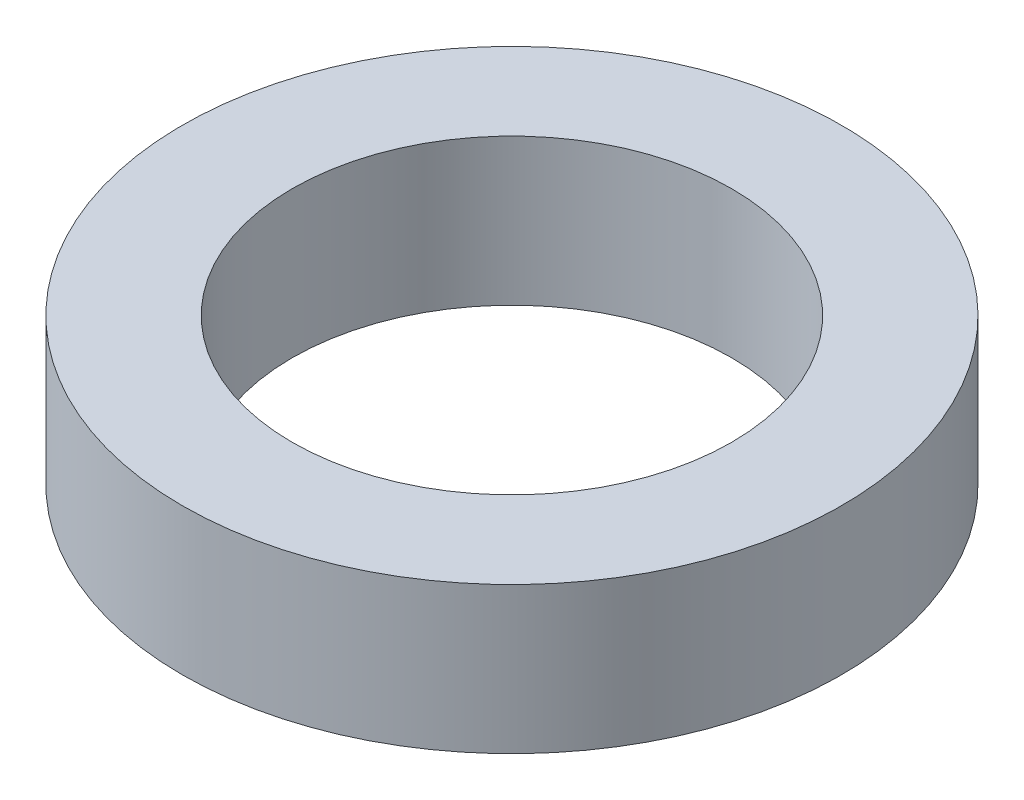
ISO-10303-21;
HEADER;
FILE_DESCRIPTION(('STEP AP214'),'2;1');
FILE_NAME('part.step','',(''),(''),'','','');
FILE_SCHEMA(('AUTOMOTIVE_DESIGN { 1 0 10303 214 1 1 1 1 }'));
ENDSEC;
DATA;
#1=APPLICATION_CONTEXT('core data for automotive mechanical design processes');
#2=APPLICATION_PROTOCOL_DEFINITION('international standard','automotive_design',2000,#1);
#3=PRODUCT_CONTEXT('',#1,'mechanical');
#4=PRODUCT('Part','Part','',(#3));
#5=PRODUCT_RELATED_PRODUCT_CATEGORY('part','',(#4));
#6=PRODUCT_DEFINITION_FORMATION('','',#4);
#7=PRODUCT_DEFINITION_CONTEXT('part definition',#1,'design');
#8=PRODUCT_DEFINITION('design','',#6,#7);
#9=PRODUCT_DEFINITION_SHAPE('','',#8);
#10=(LENGTH_UNIT() NAMED_UNIT(*) SI_UNIT(.MILLI.,.METRE.));
#11=(NAMED_UNIT(*) PLANE_ANGLE_UNIT() SI_UNIT($,.RADIAN.));
#12=(NAMED_UNIT(*) SI_UNIT($,.STERADIAN.) SOLID_ANGLE_UNIT());
#13=UNCERTAINTY_MEASURE_WITH_UNIT(LENGTH_MEASURE(1.E-05),#10,'distance_accuracy_value','');
#14=(GEOMETRIC_REPRESENTATION_CONTEXT(3) GLOBAL_UNCERTAINTY_ASSIGNED_CONTEXT((#13)) GLOBAL_UNIT_ASSIGNED_CONTEXT((#10,
#11,#12)) REPRESENTATION_CONTEXT('',''));
#15=CARTESIAN_POINT('',(0.,0.,0.));
#16=DIRECTION('',(0.,0.,1.));
#17=DIRECTION('',(1.,0.,0.));
#18=AXIS2_PLACEMENT_3D('',#15,#16,#17);
#19=CARTESIAN_POINT('',(0.,4.,0.));
#20=DIRECTION('',(0.,1.,0.));
#21=DIRECTION('',(0.,0.,1.));
#22=AXIS2_PLACEMENT_3D('',#19,#20,#21);
#23=PLANE('',#22);
#24=CARTESIAN_POINT('',(0.,4.,0.));
#25=DIRECTION('',(0.,1.,0.));
#26=DIRECTION('',(0.,0.,1.));
#27=AXIS2_PLACEMENT_3D('',#24,#25,#26);
#28=CIRCLE('',#27,9.);
#29=CARTESIAN_POINT('',(0.,4.,9.));
#30=VERTEX_POINT('',#29);
#31=EDGE_CURVE('E10',#30,#30,#28,.T.);
#32=ORIENTED_EDGE('',*,*,#31,.T.);
#33=EDGE_LOOP('',(#32));
#34=FACE_BOUND('',#33,.T.);
#35=CARTESIAN_POINT('',(0.,4.,0.));
#36=DIRECTION('',(0.,1.,0.));
#37=DIRECTION('',(0.,0.,1.));
#38=AXIS2_PLACEMENT_3D('',#35,#36,#37);
#39=CIRCLE('',#38,6.);
#40=CARTESIAN_POINT('',(0.,4.,6.));
#41=VERTEX_POINT('',#40);
#42=EDGE_CURVE('E54',#41,#41,#39,.T.);
#43=ORIENTED_EDGE('',*,*,#42,.F.);
#44=EDGE_LOOP('',(#43));
#45=FACE_BOUND('',#44,.T.);
#46=ADVANCED_FACE('F41',(#34,#45),#23,.T.);
#47=CARTESIAN_POINT('',(0.,0.,0.));
#48=DIRECTION('',(0.,1.,0.));
#49=DIRECTION('',(0.,0.,1.));
#50=AXIS2_PLACEMENT_3D('',#47,#48,#49);
#51=PLANE('',#50);
#52=CARTESIAN_POINT('',(0.,0.,0.));
#53=DIRECTION('',(0.,1.,0.));
#54=DIRECTION('',(0.,0.,1.));
#55=AXIS2_PLACEMENT_3D('',#52,#53,#54);
#56=CIRCLE('',#55,9.);
#57=CARTESIAN_POINT('',(0.,0.,9.));
#58=VERTEX_POINT('',#57);
#59=EDGE_CURVE('E45',#58,#58,#56,.T.);
#60=ORIENTED_EDGE('',*,*,#59,.F.);
#61=EDGE_LOOP('',(#60));
#62=FACE_BOUND('',#61,.T.);
#63=CARTESIAN_POINT('',(0.,0.,0.));
#64=DIRECTION('',(0.,1.,0.));
#65=DIRECTION('',(0.,0.,1.));
#66=AXIS2_PLACEMENT_3D('',#63,#64,#65);
#67=CIRCLE('',#66,6.);
#68=CARTESIAN_POINT('',(0.,0.,6.));
#69=VERTEX_POINT('',#68);
#70=EDGE_CURVE('E56',#69,#69,#67,.T.);
#71=ORIENTED_EDGE('',*,*,#70,.T.);
#72=EDGE_LOOP('',(#71));
#73=FACE_BOUND('',#72,.T.);
#74=ADVANCED_FACE('F68',(#62,#73),#51,.F.);
#75=CARTESIAN_POINT('',(0.,4.,0.));
#76=DIRECTION('',(0.,-1.,0.));
#77=DIRECTION('',(0.,0.,-1.));
#78=AXIS2_PLACEMENT_3D('',#75,#76,#77);
#79=CYLINDRICAL_SURFACE('',#78,9.);
#80=ORIENTED_EDGE('',*,*,#31,.F.);
#81=EDGE_LOOP('',(#80));
#82=FACE_BOUND('',#81,.T.);
#83=ORIENTED_EDGE('',*,*,#59,.T.);
#84=EDGE_LOOP('',(#83));
#85=FACE_BOUND('',#84,.T.);
#86=ADVANCED_FACE('F43',(#82,#85),#79,.T.);
#87=CARTESIAN_POINT('',(0.,4.,0.));
#88=DIRECTION('',(0.,-1.,0.));
#89=DIRECTION('',(0.,0.,-1.));
#90=AXIS2_PLACEMENT_3D('',#87,#88,#89);
#91=CYLINDRICAL_SURFACE('',#90,6.);
#92=ORIENTED_EDGE('',*,*,#42,.T.);
#93=EDGE_LOOP('',(#92));
#94=FACE_BOUND('',#93,.T.);
#95=ORIENTED_EDGE('',*,*,#70,.F.);
#96=EDGE_LOOP('',(#95));
#97=FACE_BOUND('',#96,.T.);
#98=ADVANCED_FACE('F64',(#94,#97),#91,.F.);
#99=CLOSED_SHELL('',(#46,#74,#86,#98));
#100=MANIFOLD_SOLID_BREP('B2',#99);
#101=ADVANCED_BREP_SHAPE_REPRESENTATION('',(#18,#100),#14);
#102=SHAPE_DEFINITION_REPRESENTATION(#9,#101);
ENDSEC;
END-ISO-10303-21;
